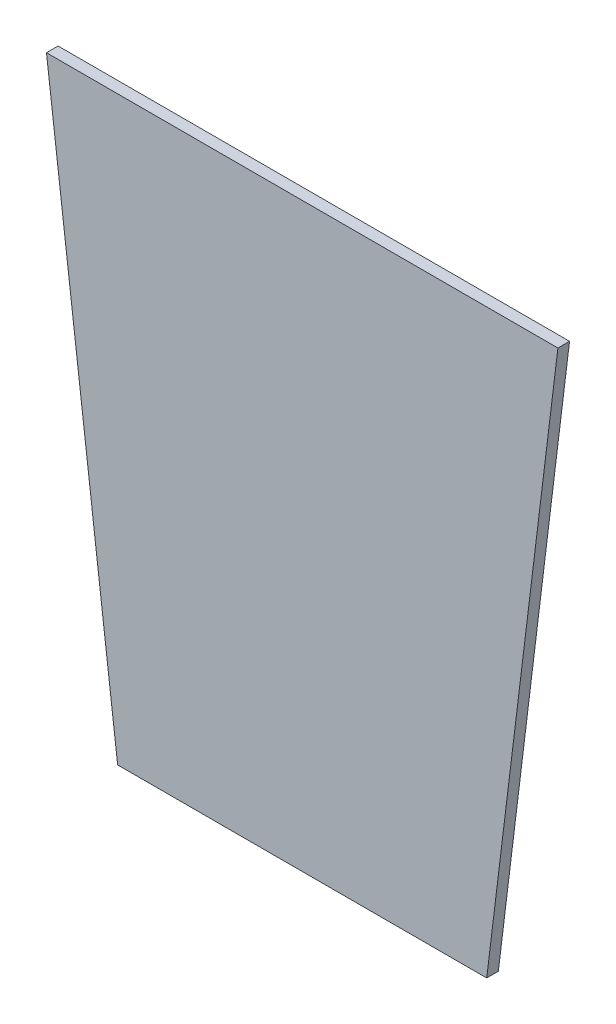
ISO-10303-21;
HEADER;
FILE_DESCRIPTION(('STEP AP214'),'2;1');
FILE_NAME('part.step','',(''),(''),'','','');
FILE_SCHEMA(('AUTOMOTIVE_DESIGN { 1 0 10303 214 1 1 1 1 }'));
ENDSEC;
DATA;
#1=APPLICATION_CONTEXT('core data for automotive mechanical design processes');
#2=APPLICATION_PROTOCOL_DEFINITION('international standard','automotive_design',2000,#1);
#3=PRODUCT_CONTEXT('',#1,'mechanical');
#4=PRODUCT('Part','Part','',(#3));
#5=PRODUCT_RELATED_PRODUCT_CATEGORY('part','',(#4));
#6=PRODUCT_DEFINITION_FORMATION('','',#4);
#7=PRODUCT_DEFINITION_CONTEXT('part definition',#1,'design');
#8=PRODUCT_DEFINITION('design','',#6,#7);
#9=PRODUCT_DEFINITION_SHAPE('','',#8);
#10=(LENGTH_UNIT() NAMED_UNIT(*) SI_UNIT(.MILLI.,.METRE.));
#11=(NAMED_UNIT(*) PLANE_ANGLE_UNIT() SI_UNIT($,.RADIAN.));
#12=(NAMED_UNIT(*) SI_UNIT($,.STERADIAN.) SOLID_ANGLE_UNIT());
#13=UNCERTAINTY_MEASURE_WITH_UNIT(LENGTH_MEASURE(1.E-05),#10,'distance_accuracy_value','');
#14=(GEOMETRIC_REPRESENTATION_CONTEXT(3) GLOBAL_UNCERTAINTY_ASSIGNED_CONTEXT((#13)) GLOBAL_UNIT_ASSIGNED_CONTEXT((#10,
#11,#12)) REPRESENTATION_CONTEXT('',''));
#15=CARTESIAN_POINT('',(0.,0.,0.));
#16=DIRECTION('',(0.,0.,1.));
#17=DIRECTION('',(1.,0.,0.));
#18=AXIS2_PLACEMENT_3D('',#15,#16,#17);
#19=CARTESIAN_POINT('',(-63.5,0.,-4.));
#20=DIRECTION('',(-0.992580278001872,-0.121591084055229,0.));
#21=DIRECTION('',(0.121591084055229,-0.992580278001872,0.));
#22=AXIS2_PLACEMENT_3D('',#19,#20,#21);
#23=PLANE('',#22);
#24=DIRECTION('',(0.121591084055229,-0.992580278001872,0.));
#25=VECTOR('',#24,1.);
#26=CARTESIAN_POINT('',(-63.5,0.,0.));
#27=LINE('',#26,#25);
#28=CARTESIAN_POINT('',(-88.,200.,0.));
#29=VERTEX_POINT('',#28);
#30=CARTESIAN_POINT('',(-63.5,0.,0.));
#31=VERTEX_POINT('',#30);
#32=EDGE_CURVE('E99',#29,#31,#27,.T.);
#33=ORIENTED_EDGE('',*,*,#32,.F.);
#34=DIRECTION('',(0.,0.,1.));
#35=VECTOR('',#34,1.);
#36=CARTESIAN_POINT('',(-88.,200.,-4.));
#37=LINE('',#36,#35);
#38=CARTESIAN_POINT('',(-88.,200.,-4.));
#39=VERTEX_POINT('',#38);
#40=EDGE_CURVE('E11',#39,#29,#37,.T.);
#41=ORIENTED_EDGE('',*,*,#40,.F.);
#42=DIRECTION('',(0.121591084055229,-0.992580278001872,0.));
#43=VECTOR('',#42,1.);
#44=CARTESIAN_POINT('',(-63.5,0.,-4.));
#45=LINE('',#44,#43);
#46=CARTESIAN_POINT('',(-63.5,0.,-4.));
#47=VERTEX_POINT('',#46);
#48=EDGE_CURVE('E93',#39,#47,#45,.T.);
#49=ORIENTED_EDGE('',*,*,#48,.T.);
#50=DIRECTION('',(0.,0.,1.));
#51=VECTOR('',#50,1.);
#52=CARTESIAN_POINT('',(-63.5,0.,-4.));
#53=LINE('',#52,#51);
#54=EDGE_CURVE('E38',#47,#31,#53,.T.);
#55=ORIENTED_EDGE('',*,*,#54,.T.);
#56=EDGE_LOOP('',(#33,#41,#49,#55));
#57=FACE_BOUND('',#56,.T.);
#58=ADVANCED_FACE('F35',(#57),#23,.T.);
#59=CARTESIAN_POINT('',(-88.,200.,-4.));
#60=DIRECTION('',(0.,1.,0.));
#61=DIRECTION('',(-1.,0.,0.));
#62=AXIS2_PLACEMENT_3D('',#59,#60,#61);
#63=PLANE('',#62);
#64=DIRECTION('',(-1.,0.,0.));
#65=VECTOR('',#64,1.);
#66=CARTESIAN_POINT('',(-88.,200.,0.));
#67=LINE('',#66,#65);
#68=CARTESIAN_POINT('',(88.,200.,0.));
#69=VERTEX_POINT('',#68);
#70=EDGE_CURVE('E95',#69,#29,#67,.T.);
#71=ORIENTED_EDGE('',*,*,#70,.F.);
#72=DIRECTION('',(0.,0.,1.));
#73=VECTOR('',#72,1.);
#74=CARTESIAN_POINT('',(88.,200.,-4.));
#75=LINE('',#74,#73);
#76=CARTESIAN_POINT('',(88.,200.,-4.));
#77=VERTEX_POINT('',#76);
#78=EDGE_CURVE('E44',#77,#69,#75,.T.);
#79=ORIENTED_EDGE('',*,*,#78,.F.);
#80=DIRECTION('',(-1.,0.,0.));
#81=VECTOR('',#80,1.);
#82=CARTESIAN_POINT('',(-88.,200.,-4.));
#83=LINE('',#82,#81);
#84=EDGE_CURVE('E90',#77,#39,#83,.T.);
#85=ORIENTED_EDGE('',*,*,#84,.T.);
#86=ORIENTED_EDGE('',*,*,#40,.T.);
#87=EDGE_LOOP('',(#71,#79,#85,#86));
#88=FACE_BOUND('',#87,.T.);
#89=ADVANCED_FACE('F109',(#88),#63,.T.);
#90=CARTESIAN_POINT('',(88.,200.,-4.));
#91=DIRECTION('',(0.992580278001872,-0.121591084055229,0.));
#92=DIRECTION('',(0.121591084055229,0.992580278001872,0.));
#93=AXIS2_PLACEMENT_3D('',#90,#91,#92);
#94=PLANE('',#93);
#95=DIRECTION('',(0.121591084055229,0.992580278001872,0.));
#96=VECTOR('',#95,1.);
#97=CARTESIAN_POINT('',(88.,200.,0.));
#98=LINE('',#97,#96);
#99=CARTESIAN_POINT('',(63.5,0.,0.));
#100=VERTEX_POINT('',#99);
#101=EDGE_CURVE('E85',#100,#69,#98,.T.);
#102=ORIENTED_EDGE('',*,*,#101,.F.);
#103=DIRECTION('',(0.,0.,1.));
#104=VECTOR('',#103,1.);
#105=CARTESIAN_POINT('',(63.5,0.,-4.));
#106=LINE('',#105,#104);
#107=CARTESIAN_POINT('',(63.5,0.,-4.));
#108=VERTEX_POINT('',#107);
#109=EDGE_CURVE('E80',#108,#100,#106,.T.);
#110=ORIENTED_EDGE('',*,*,#109,.F.);
#111=DIRECTION('',(0.121591084055229,0.992580278001872,0.));
#112=VECTOR('',#111,1.);
#113=CARTESIAN_POINT('',(88.,200.,-4.));
#114=LINE('',#113,#112);
#115=EDGE_CURVE('E83',#108,#77,#114,.T.);
#116=ORIENTED_EDGE('',*,*,#115,.T.);
#117=ORIENTED_EDGE('',*,*,#78,.T.);
#118=EDGE_LOOP('',(#102,#110,#116,#117));
#119=FACE_BOUND('',#118,.T.);
#120=ADVANCED_FACE('F82',(#119),#94,.T.);
#121=CARTESIAN_POINT('',(63.5,0.,-4.));
#122=DIRECTION('',(0.,-1.,0.));
#123=DIRECTION('',(1.,0.,0.));
#124=AXIS2_PLACEMENT_3D('',#121,#122,#123);
#125=PLANE('',#124);
#126=DIRECTION('',(1.,0.,0.));
#127=VECTOR('',#126,1.);
#128=CARTESIAN_POINT('',(63.5,0.,0.));
#129=LINE('',#128,#127);
#130=EDGE_CURVE('E102',#31,#100,#129,.T.);
#131=ORIENTED_EDGE('',*,*,#130,.F.);
#132=ORIENTED_EDGE('',*,*,#54,.F.);
#133=DIRECTION('',(1.,0.,0.));
#134=VECTOR('',#133,1.);
#135=CARTESIAN_POINT('',(63.5,0.,-4.));
#136=LINE('',#135,#134);
#137=EDGE_CURVE('E89',#47,#108,#136,.T.);
#138=ORIENTED_EDGE('',*,*,#137,.T.);
#139=ORIENTED_EDGE('',*,*,#109,.T.);
#140=EDGE_LOOP('',(#131,#132,#138,#139));
#141=FACE_BOUND('',#140,.T.);
#142=ADVANCED_FACE('F92',(#141),#125,.T.);
#143=CARTESIAN_POINT('',(0.,0.,-4.));
#144=DIRECTION('',(0.,0.,-1.));
#145=DIRECTION('',(-1.,0.,0.));
#146=AXIS2_PLACEMENT_3D('',#143,#144,#145);
#147=PLANE('',#146);
#148=ORIENTED_EDGE('',*,*,#48,.F.);
#149=ORIENTED_EDGE('',*,*,#84,.F.);
#150=ORIENTED_EDGE('',*,*,#115,.F.);
#151=ORIENTED_EDGE('',*,*,#137,.F.);
#152=EDGE_LOOP('',(#148,#149,#150,#151));
#153=FACE_BOUND('',#152,.T.);
#154=ADVANCED_FACE('F88',(#153),#147,.T.);
#155=CARTESIAN_POINT('',(0.,0.,0.));
#156=DIRECTION('',(0.,0.,-1.));
#157=DIRECTION('',(-1.,0.,0.));
#158=AXIS2_PLACEMENT_3D('',#155,#156,#157);
#159=PLANE('',#158);
#160=ORIENTED_EDGE('',*,*,#32,.T.);
#161=ORIENTED_EDGE('',*,*,#130,.T.);
#162=ORIENTED_EDGE('',*,*,#101,.T.);
#163=ORIENTED_EDGE('',*,*,#70,.T.);
#164=EDGE_LOOP('',(#160,#161,#162,#163));
#165=FACE_BOUND('',#164,.T.);
#166=ADVANCED_FACE('F108',(#165),#159,.F.);
#167=CLOSED_SHELL('',(#58,#89,#120,#142,#154,#166));
#168=MANIFOLD_SOLID_BREP('B2',#167);
#169=ADVANCED_BREP_SHAPE_REPRESENTATION('',(#18,#168),#14);
#170=SHAPE_DEFINITION_REPRESENTATION(#9,#169);
ENDSEC;
END-ISO-10303-21;
